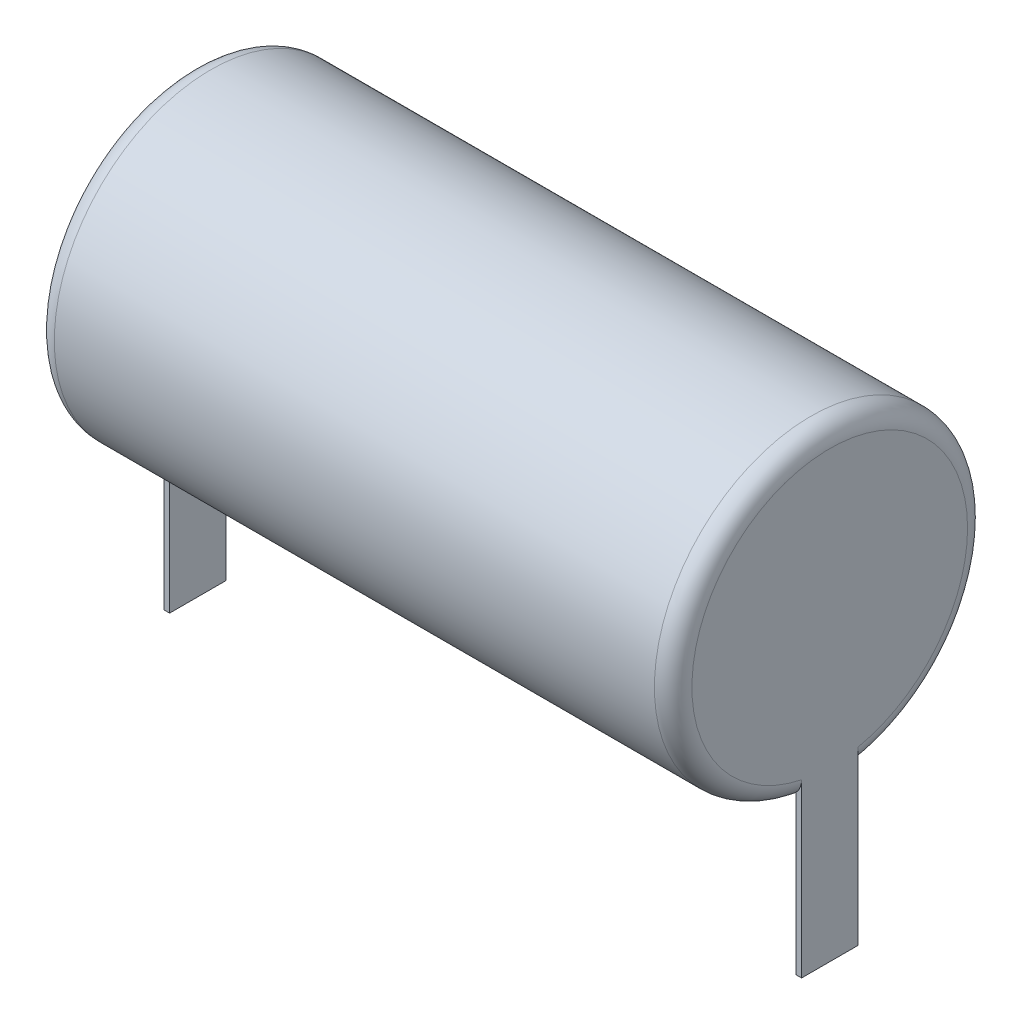
ISO-10303-21;
HEADER;
FILE_DESCRIPTION(('STEP AP214'),'2;1');
FILE_NAME('part.step','',(''),(''),'','','');
FILE_SCHEMA(('AUTOMOTIVE_DESIGN { 1 0 10303 214 1 1 1 1 }'));
ENDSEC;
DATA;
#1=APPLICATION_CONTEXT('core data for automotive mechanical design processes');
#2=APPLICATION_PROTOCOL_DEFINITION('international standard','automotive_design',2000,#1);
#3=PRODUCT_CONTEXT('',#1,'mechanical');
#4=PRODUCT('Part','Part','',(#3));
#5=PRODUCT_RELATED_PRODUCT_CATEGORY('part','',(#4));
#6=PRODUCT_DEFINITION_FORMATION('','',#4);
#7=PRODUCT_DEFINITION_CONTEXT('part definition',#1,'design');
#8=PRODUCT_DEFINITION('design','',#6,#7);
#9=PRODUCT_DEFINITION_SHAPE('','',#8);
#10=(LENGTH_UNIT() NAMED_UNIT(*) SI_UNIT(.MILLI.,.METRE.));
#11=(NAMED_UNIT(*) PLANE_ANGLE_UNIT() SI_UNIT($,.RADIAN.));
#12=(NAMED_UNIT(*) SI_UNIT($,.STERADIAN.) SOLID_ANGLE_UNIT());
#13=UNCERTAINTY_MEASURE_WITH_UNIT(LENGTH_MEASURE(1.E-05),#10,'distance_accuracy_value','');
#14=(GEOMETRIC_REPRESENTATION_CONTEXT(3) GLOBAL_UNCERTAINTY_ASSIGNED_CONTEXT((#13)) GLOBAL_UNIT_ASSIGNED_CONTEXT((#10,
#11,#12)) REPRESENTATION_CONTEXT('',''));
#15=CARTESIAN_POINT('',(0.,0.,0.));
#16=DIRECTION('',(0.,0.,1.));
#17=DIRECTION('',(1.,0.,0.));
#18=AXIS2_PLACEMENT_3D('',#15,#16,#17);
#19=CARTESIAN_POINT('',(-16.,0.,0.));
#20=DIRECTION('',(1.,0.,0.));
#21=DIRECTION('',(0.,0.,-1.));
#22=AXIS2_PLACEMENT_3D('',#19,#20,#21);
#23=TOROIDAL_SURFACE('',#22,7.35,1.);
#24=CARTESIAN_POINT('',(-16.,0.,0.));
#25=DIRECTION('',(1.,0.,0.));
#26=DIRECTION('',(0.,0.,-1.));
#27=AXIS2_PLACEMENT_3D('',#24,#25,#26);
#28=CIRCLE('',#27,8.35);
#29=CARTESIAN_POINT('',(-16.,0.,-8.35));
#30=VERTEX_POINT('',#29);
#31=EDGE_CURVE('E157',#30,#30,#28,.T.);
#32=ORIENTED_EDGE('',*,*,#31,.F.);
#33=EDGE_LOOP('',(#32));
#34=FACE_BOUND('',#33,.T.);
#35=CARTESIAN_POINT('',(-16.7,0.,0.));
#36=DIRECTION('',(1.,0.,0.));
#37=DIRECTION('',(0.,0.,-1.));
#38=AXIS2_PLACEMENT_3D('',#35,#36,#37);
#39=CIRCLE('',#38,8.06414284285429);
#40=CARTESIAN_POINT('',(-16.7,-7.92340834426436,-1.5));
#41=VERTEX_POINT('',#40);
#42=CARTESIAN_POINT('',(-16.7,-7.92340834426436,1.5));
#43=VERTEX_POINT('',#42);
#44=EDGE_CURVE('E209',#41,#43,#39,.F.);
#45=ORIENTED_EDGE('',*,*,#44,.F.);
#46=CARTESIAN_POINT('',(-16.6932983509553,-7.93003167277061,-1.5));
#47=CARTESIAN_POINT('',(-16.7342427925218,-7.88993890090227,-1.5));
#48=CARTESIAN_POINT('',(-16.7717881051022,-7.84630802779094,-1.5));
#49=CARTESIAN_POINT('',(-16.839015966995,-7.75329999233039,-1.5));
#50=CARTESIAN_POINT('',(-16.8686872504467,-7.70391474056949,-1.5));
#51=CARTESIAN_POINT('',(-16.9193252697565,-7.60094115994319,-1.5));
#52=CARTESIAN_POINT('',(-16.9403027302009,-7.54735810708623,-1.5));
#53=CARTESIAN_POINT('',(-16.9730859548653,-7.43747732619323,-1.5));
#54=CARTESIAN_POINT('',(-16.9848940256337,-7.38118028464449,-1.5));
#55=CARTESIAN_POINT('',(-16.9991777527898,-7.26667535349827,-1.5));
#56=CARTESIAN_POINT('',(-17.0015309191646,-7.20845217585216,-1.5));
#57=CARTESIAN_POINT('',(-16.9965387100887,-7.09241861168099,-1.5));
#58=CARTESIAN_POINT('',(-16.9891921439774,-7.03460827670901,-1.5));
#59=CARTESIAN_POINT('',(-16.9648787296374,-6.92041502029103,-1.5));
#60=CARTESIAN_POINT('',(-16.9478126554128,-6.86405318828612,-1.5));
#61=CARTESIAN_POINT('',(-16.9044353948116,-6.7550029797435,-1.5));
#62=CARTESIAN_POINT('',(-16.878124078997,-6.70231465464912,-1.5));
#63=CARTESIAN_POINT('',(-16.8170322363561,-6.6023091454247,-1.5));
#64=CARTESIAN_POINT('',(-16.7822769400861,-6.55497656473435,-1.5));
#65=CARTESIAN_POINT('',(-16.7051774501281,-6.46695355992478,-1.5));
#66=CARTESIAN_POINT('',(-16.6628339376824,-6.42626254017656,-1.5));
#67=CARTESIAN_POINT('',(-16.5725624484104,-6.35350936319254,-1.5));
#68=CARTESIAN_POINT('',(-16.5247507452171,-6.3213030273661,-1.5));
#69=CARTESIAN_POINT('',(-16.4242834799444,-6.26562880258829,-1.5));
#70=CARTESIAN_POINT('',(-16.3716287154141,-6.24215947803885,-1.5));
#71=CARTESIAN_POINT('',(-16.2644602299688,-6.20527073723047,-1.5));
#72=CARTESIAN_POINT('',(-16.210031947594,-6.1916029996893,-1.5));
#73=CARTESIAN_POINT('',(-16.0996397513237,-6.17380112044175,-1.5));
#74=CARTESIAN_POINT('',(-16.0436760445235,-6.16966569936779,-1.5));
#75=CARTESIAN_POINT('',(-15.9329551586638,-6.17105796857369,-1.5));
#76=CARTESIAN_POINT('',(-15.8781955515978,-6.17640058114026,-1.5));
#77=CARTESIAN_POINT('',(-15.770355065256,-6.1962082619048,-1.5));
#78=CARTESIAN_POINT('',(-15.7172741490863,-6.21067312946927,-1.5));
#79=CARTESIAN_POINT('',(-15.6142751916898,-6.24824229885436,-1.5));
#80=CARTESIAN_POINT('',(-15.5643568292509,-6.27134572162989,-1.5));
#81=CARTESIAN_POINT('',(-15.4690091570122,-6.32545658718836,-1.5));
#82=CARTESIAN_POINT('',(-15.4235802122787,-6.35646467202244,-1.5));
#83=CARTESIAN_POINT('',(-15.3375725735747,-6.4260977120265,-1.5));
#84=CARTESIAN_POINT('',(-15.2971005249041,-6.46485431817332,-1.5));
#85=CARTESIAN_POINT('',(-15.2230350958501,-6.54845929569506,-1.5));
#86=CARTESIAN_POINT('',(-15.1894426121338,-6.5933084598949,-1.5));
#87=CARTESIAN_POINT('',(-15.1291792667634,-6.68907368923822,-1.5));
#88=CARTESIAN_POINT('',(-15.102710306425,-6.74011684382195,-1.5));
#89=CARTESIAN_POINT('',(-15.0585288190707,-6.84586226150391,-1.5));
#90=CARTESIAN_POINT('',(-15.0408172858941,-6.90056493910488,-1.5));
#91=CARTESIAN_POINT('',(-15.0143421609444,-7.01321641980032,-1.5));
#92=CARTESIAN_POINT('',(-15.0057583950004,-7.07120755955228,-1.5));
#93=CARTESIAN_POINT('',(-14.9983938352166,-7.18781120226736,-1.5));
#94=CARTESIAN_POINT('',(-14.9996135067966,-7.24642373459927,-1.5));
#95=CARTESIAN_POINT('',(-15.011886916366,-7.36290605564904,-1.5));
#96=CARTESIAN_POINT('',(-15.0229890459036,-7.420770766236,-1.5));
#97=CARTESIAN_POINT('',(-15.0548390263584,-7.53378452495359,-1.5));
#98=CARTESIAN_POINT('',(-15.0755865513244,-7.58893366478304,-1.5));
#99=CARTESIAN_POINT('',(-15.1259706687922,-7.69439870691972,-1.5));
#100=CARTESIAN_POINT('',(-15.1555249911322,-7.74475388483379,-1.5));
#101=CARTESIAN_POINT('',(-15.2228061710563,-7.83967412278299,-1.5));
#102=CARTESIAN_POINT('',(-15.2605323292827,-7.88423967778073,-1.5));
#103=CARTESIAN_POINT('',(-15.3424054715157,-7.96550208855247,-1.5));
#104=CARTESIAN_POINT('',(-15.3864327147133,-8.0023195719462,-1.5));
#105=CARTESIAN_POINT('',(-15.4801356092621,-8.06788378259372,-1.5));
#106=CARTESIAN_POINT('',(-15.5298107053977,-8.096631302208,-1.5));
#107=CARTESIAN_POINT('',(-15.6324682907002,-8.14472354147739,-1.5));
#108=CARTESIAN_POINT('',(-15.6853783969373,-8.16422282346844,-1.5));
#109=CARTESIAN_POINT('',(-15.7937412130391,-8.19394010966336,-1.5));
#110=CARTESIAN_POINT('',(-15.8491936232795,-8.20415920464868,-1.5));
#111=CARTESIAN_POINT('',(-15.9603554957168,-8.21493118503891,-1.5));
#112=CARTESIAN_POINT('',(-16.0160538994183,-8.2155985264981,-1.5));
#113=CARTESIAN_POINT('',(-16.1267812727805,-8.20753919286053,-1.5));
#114=CARTESIAN_POINT('',(-16.1818100887574,-8.19881040081103,-1.5));
#115=CARTESIAN_POINT('',(-16.2894690136652,-8.17226527731808,-1.5));
#116=CARTESIAN_POINT('',(-16.3421050240041,-8.15447279149705,-1.5));
#117=CARTESIAN_POINT('',(-16.4436206524588,-8.11036485306026,-1.5));
#118=CARTESIAN_POINT('',(-16.4925047795518,-8.08405983562381,-1.5));
#119=CARTESIAN_POINT('',(-16.5665550062249,-8.03588453858669,-1.5));
#120=CARTESIAN_POINT('',(-16.5933583829525,-8.01647980792209,-1.5));
#121=CARTESIAN_POINT('',(-16.6449178180618,-7.97511988925947,-1.5));
#122=CARTESIAN_POINT('',(-16.6696738954734,-7.95316472497284,-1.5));
#123=CARTESIAN_POINT('',(-16.6932983509553,-7.93003167277061,-1.5));
#124=B_SPLINE_CURVE_WITH_KNOTS('',3,(#46,#47,#48,#49,#50,#51,#52,#53,#54,#55,#56,#57,#58,#59,
#60,#61,#62,#63,#64,#65,#66,#67,#68,#69,#70,#71,#72,#73,#74,#75,#76,#77,#78,#79,#80,#81,#82,#83,
#84,#85,#86,#87,#88,#89,#90,#91,#92,#93,#94,#95,#96,#97,#98,#99,#100,#101,#102,#103,#104,#105,
#106,#107,#108,#109,#110,#111,#112,#113,#114,#115,#116,#117,#118,#119,#120,#121,#122,#123),
.UNSPECIFIED.,.T.,.F.,(4,2,2,2,2,2,2,2,2,2,2,2,2,2,2,2,2,2,2,2,2,2,2,2,2,2,2,2,2,2,2,2,2,2,2,2,
2,2,4),(0.,0.17179205602247,0.343828596326594,0.515652278337541,0.687432724304037,
0.861431577976805,1.03545179232621,1.21128125935067,1.38711318817424,1.56242605786841,
1.73772319649101,1.90981491585102,2.08187834593791,2.24941178026751,2.41692272800326,
2.58119859810031,2.74547085526475,2.90972640090348,3.07399529234788,3.24133750591967,
3.40870151664087,3.58040213193854,3.7521222282645,3.92716602764579,4.10221813730899,
4.27813217107007,4.4540402605241,4.62835401174839,4.80265285083588,4.97399576288819,
5.14532184551192,5.31367384275298,5.48200604955124,5.64831946541481,5.8146703596033,
5.98058584518084,6.14629870706281,6.24542160027003,6.34454357200466),.UNSPECIFIED.);
#125=CARTESIAN_POINT('',(-17.,-7.19531097312687,-1.5));
#126=VERTEX_POINT('',#125);
#127=EDGE_CURVE('E11',#41,#126,#124,.T.);
#128=ORIENTED_EDGE('',*,*,#127,.T.);
#129=CARTESIAN_POINT('',(-17.,0.,0.));
#130=DIRECTION('',(1.,0.,0.));
#131=DIRECTION('',(0.,0.,-1.));
#132=AXIS2_PLACEMENT_3D('',#129,#130,#131);
#133=CIRCLE('',#132,7.35);
#134=CARTESIAN_POINT('',(-17.,-7.19531097312687,1.5));
#135=VERTEX_POINT('',#134);
#136=EDGE_CURVE('E160',#135,#126,#133,.F.);
#137=ORIENTED_EDGE('',*,*,#136,.F.);
#138=CARTESIAN_POINT('',(-16.6932983509553,-7.93003167277061,1.5));
#139=CARTESIAN_POINT('',(-16.653355639225,-7.96913654820077,1.5));
#140=CARTESIAN_POINT('',(-16.6101217975499,-8.00493182752507,1.5));
#141=CARTESIAN_POINT('',(-16.5182391478145,-8.06880792635938,1.5));
#142=CARTESIAN_POINT('',(-16.4695849421854,-8.09688095785975,1.5));
#143=CARTESIAN_POINT('',(-16.3682297666322,-8.14442965836644,1.5));
#144=CARTESIAN_POINT('',(-16.3155284636396,-8.16390461887592,1.5));
#145=CARTESIAN_POINT('',(-16.2075993292904,-8.19364054112096,1.5));
#146=CARTESIAN_POINT('',(-16.1523720899973,-8.20390365054208,1.5));
#147=CARTESIAN_POINT('',(-16.0414318975256,-8.21485771362063,1.5));
#148=CARTESIAN_POINT('',(-15.9857265750915,-8.21562602473534,1.5));
#149=CARTESIAN_POINT('',(-15.8749826974606,-8.20776646079718,1.5));
#150=CARTESIAN_POINT('',(-15.8199441428704,-8.1991385771974,1.5));
#151=CARTESIAN_POINT('',(-15.7122732655882,-8.17279562752665,1.5));
#152=CARTESIAN_POINT('',(-15.6596338981336,-8.15510932164381,1.5));
#153=CARTESIAN_POINT('',(-15.5580454529198,-8.11120373592409,1.5));
#154=CARTESIAN_POINT('',(-15.5090964321578,-8.08498432432751,1.5));
#155=CARTESIAN_POINT('',(-15.4159327544813,-8.02460580936885,1.5));
#156=CARTESIAN_POINT('',(-15.3717497457166,-7.99039789889281,1.5));
#157=CARTESIAN_POINT('',(-15.2896555547892,-7.91514358688295,1.5));
#158=CARTESIAN_POINT('',(-15.2517447445835,-7.87409678007518,1.5));
#159=CARTESIAN_POINT('',(-15.1826926535139,-7.78572694629688,1.5));
#160=CARTESIAN_POINT('',(-15.1516534392871,-7.73832418732267,1.5));
#161=CARTESIAN_POINT('',(-15.0978133175113,-7.6390522925289,1.5));
#162=CARTESIAN_POINT('',(-15.0750131506816,-7.58718275564922,1.5));
#163=CARTESIAN_POINT('',(-15.0378725779276,-7.47946777371243,1.5));
#164=CARTESIAN_POINT('',(-15.0236892770978,-7.42356815353907,1.5));
#165=CARTESIAN_POINT('',(-15.004750607751,-7.31019389469429,1.5));
#166=CARTESIAN_POINT('',(-14.9999961115766,-7.25271911078913,1.5));
#167=CARTESIAN_POINT('',(-15.0000039529322,-7.13687936313734,1.5));
#168=CARTESIAN_POINT('',(-15.0049145579158,-7.07851437442613,1.5));
#169=CARTESIAN_POINT('',(-15.0244003174773,-6.96341802535855,1.5));
#170=CARTESIAN_POINT('',(-15.0389760570289,-6.90668676409895,1.5));
#171=CARTESIAN_POINT('',(-15.077526277898,-6.79612292880134,1.5));
#172=CARTESIAN_POINT('',(-15.1015570797109,-6.7423099650679,1.5));
#173=CARTESIAN_POINT('',(-15.158388433953,-6.6395283215607,1.5));
#174=CARTESIAN_POINT('',(-15.1911888145816,-6.59055954691247,1.5));
#175=CARTESIAN_POINT('',(-15.2643644841738,-6.49936151433588,1.5));
#176=CARTESIAN_POINT('',(-15.3046700458758,-6.45707636041812,1.5));
#177=CARTESIAN_POINT('',(-15.3919537774551,-6.38006392927021,1.5));
#178=CARTESIAN_POINT('',(-15.4389311102165,-6.34533570524432,1.5));
#179=CARTESIAN_POINT('',(-15.5370950266685,-6.28528828200057,1.5));
#180=CARTESIAN_POINT('',(-15.5881618800943,-6.25977342597878,1.5));
#181=CARTESIAN_POINT('',(-15.6939323479001,-6.21793859617922,1.5));
#182=CARTESIAN_POINT('',(-15.7486353492256,-6.20161707677874,1.5));
#183=CARTESIAN_POINT('',(-15.8586175795718,-6.1790380587042,1.5));
#184=CARTESIAN_POINT('',(-15.9138461749158,-6.17253352989689,1.5));
#185=CARTESIAN_POINT('',(-16.0246019328013,-6.16902489809469,1.5));
#186=CARTESIAN_POINT('',(-16.0801290661989,-6.17201988396826,1.5));
#187=CARTESIAN_POINT('',(-16.1891467442306,-6.18730328614475,1.5));
#188=CARTESIAN_POINT('',(-16.2426543870102,-6.1994702776283,1.5));
#189=CARTESIAN_POINT('',(-16.3468915696101,-6.23254796206652,1.5));
#190=CARTESIAN_POINT('',(-16.397621054023,-6.25345882933625,1.5));
#191=CARTESIAN_POINT('',(-16.4953107745569,-6.30354693475418,1.5));
#192=CARTESIAN_POINT('',(-16.5422389051554,-6.33278671429115,1.5));
#193=CARTESIAN_POINT('',(-16.630665207172,-6.39856200332105,1.5));
#194=CARTESIAN_POINT('',(-16.6721627871495,-6.4350983063847,1.5));
#195=CARTESIAN_POINT('',(-16.7495810127158,-6.51531964984516,1.5));
#196=CARTESIAN_POINT('',(-16.7853507797867,-6.5591502627511,1.5));
#197=CARTESIAN_POINT('',(-16.8492385366322,-6.65207163940579,1.5));
#198=CARTESIAN_POINT('',(-16.8773555061063,-6.70116310333667,1.5));
#199=CARTESIAN_POINT('',(-16.9258524178485,-6.80452968857843,1.5));
#200=CARTESIAN_POINT('',(-16.9460222442221,-6.8589034550856,1.5));
#201=CARTESIAN_POINT('',(-16.9770945740093,-6.97023654846048,1.5));
#202=CARTESIAN_POINT('',(-16.987996566035,-7.02719601782148,1.5));
#203=CARTESIAN_POINT('',(-17.0003319281767,-7.14296058405481,1.5));
#204=CARTESIAN_POINT('',(-17.001627380219,-7.20178043207441,1.5));
#205=CARTESIAN_POINT('',(-16.9943192946588,-7.31882026342554,1.5));
#206=CARTESIAN_POINT('',(-16.9857131778446,-7.37704008647296,1.5));
#207=CARTESIAN_POINT('',(-16.9587954276732,-7.49117298250463,1.5));
#208=CARTESIAN_POINT('',(-16.9404863986083,-7.54708667012465,1.5));
#209=CARTESIAN_POINT('',(-16.8946279131629,-7.65493508374522,1.5));
#210=CARTESIAN_POINT('',(-16.867090047683,-7.70687470094388,1.5));
#211=CARTESIAN_POINT('',(-16.814964820096,-7.78755258328908,1.5));
#212=CARTESIAN_POINT('',(-16.792865968614,-7.81792724836252,1.5));
#213=CARTESIAN_POINT('',(-16.745438471585,-7.87604222099989,1.5));
#214=CARTESIAN_POINT('',(-16.7201098624096,-7.90378255822395,1.5));
#215=CARTESIAN_POINT('',(-16.6932983509553,-7.93003167277061,1.5));
#216=B_SPLINE_CURVE_WITH_KNOTS('',3,(#138,#139,#140,#141,#142,#143,#144,#145,#146,#147,#148,
#149,#150,#151,#152,#153,#154,#155,#156,#157,#158,#159,#160,#161,#162,#163,#164,#165,#166,#167,
#168,#169,#170,#171,#172,#173,#174,#175,#176,#177,#178,#179,#180,#181,#182,#183,#184,#185,#186,
#187,#188,#189,#190,#191,#192,#193,#194,#195,#196,#197,#198,#199,#200,#201,#202,#203,#204,#205,
#206,#207,#208,#209,#210,#211,#212,#213,#214,#215),.UNSPECIFIED.,.T.,.F.,(4,2,2,2,2,2,2,2,2,2,2,
2,2,2,2,2,2,2,2,2,2,2,2,2,2,2,2,2,2,2,2,2,2,2,2,2,2,2,4),(0.,0.167560271265016,
0.335288915282714,0.503031377870257,0.670734722184227,0.837070819029985,1.00340706717776,
1.16921844721817,1.33503238767379,1.50188720177169,1.66875190722796,1.83794979286456,
2.00716288620071,2.17937514606439,2.35160333807319,2.52649419263126,2.7013956332705,
2.87735506862727,3.05331105709841,3.22770723940344,3.4020815592913,3.57249831573898,
3.74288641244105,3.90891095507594,4.07491957420031,4.23876823770586,4.40262016780085,
4.56773644197413,4.73287068400147,4.90181749545365,5.07078682052546,5.24396405717499,
5.41715084891468,5.59281930131162,5.76853352309182,5.94420060648521,6.11964788358767,
6.23212384043228,6.34459853074962),.UNSPECIFIED.);
#217=EDGE_CURVE('E47',#135,#43,#216,.T.);
#218=ORIENTED_EDGE('',*,*,#217,.T.);
#219=EDGE_LOOP('',(#45,#128,#137,#218));
#220=FACE_BOUND('',#219,.T.);
#221=ADVANCED_FACE('F34',(#34,#220),#23,.T.);
#222=CARTESIAN_POINT('',(17.,0.,0.));
#223=DIRECTION('',(-1.,0.,0.));
#224=DIRECTION('',(0.,0.,1.));
#225=AXIS2_PLACEMENT_3D('',#222,#223,#224);
#226=CYLINDRICAL_SURFACE('',#225,8.35);
#227=ORIENTED_EDGE('',*,*,#31,.T.);
#228=EDGE_LOOP('',(#227));
#229=FACE_BOUND('',#228,.T.);
#230=CARTESIAN_POINT('',(16.,0.,0.));
#231=DIRECTION('',(1.,0.,0.));
#232=DIRECTION('',(0.,0.,-1.));
#233=AXIS2_PLACEMENT_3D('',#230,#231,#232);
#234=CIRCLE('',#233,8.35);
#235=CARTESIAN_POINT('',(16.,0.,-8.35));
#236=VERTEX_POINT('',#235);
#237=EDGE_CURVE('E152',#236,#236,#234,.F.);
#238=ORIENTED_EDGE('',*,*,#237,.T.);
#239=EDGE_LOOP('',(#238));
#240=FACE_BOUND('',#239,.T.);
#241=ADVANCED_FACE('F195',(#229,#240),#226,.T.);
#242=CARTESIAN_POINT('',(17.,0.,0.));
#243=DIRECTION('',(1.,0.,0.));
#244=DIRECTION('',(0.,0.,-1.));
#245=AXIS2_PLACEMENT_3D('',#242,#243,#244);
#246=PLANE('',#245);
#247=CARTESIAN_POINT('',(17.,0.,0.));
#248=DIRECTION('',(1.,0.,0.));
#249=DIRECTION('',(0.,0.,-1.));
#250=AXIS2_PLACEMENT_3D('',#247,#248,#249);
#251=CIRCLE('',#250,7.35);
#252=CARTESIAN_POINT('',(17.,-7.19531097312687,-1.5));
#253=VERTEX_POINT('',#252);
#254=CARTESIAN_POINT('',(17.,-7.19531097312687,1.5));
#255=VERTEX_POINT('',#254);
#256=EDGE_CURVE('E162',#253,#255,#251,.T.);
#257=ORIENTED_EDGE('',*,*,#256,.T.);
#258=DIRECTION('',(0.,-1.,0.));
#259=VECTOR('',#258,1.);
#260=CARTESIAN_POINT('',(17.,-16.35,1.5));
#261=LINE('',#260,#259);
#262=CARTESIAN_POINT('',(17.,-16.35,1.5));
#263=VERTEX_POINT('',#262);
#264=EDGE_CURVE('E147',#255,#263,#261,.T.);
#265=ORIENTED_EDGE('',*,*,#264,.T.);
#266=DIRECTION('',(0.,0.,-1.));
#267=VECTOR('',#266,1.);
#268=CARTESIAN_POINT('',(17.,-16.35,1.5));
#269=LINE('',#268,#267);
#270=CARTESIAN_POINT('',(17.,-16.35,-1.5));
#271=VERTEX_POINT('',#270);
#272=EDGE_CURVE('E140',#263,#271,#269,.T.);
#273=ORIENTED_EDGE('',*,*,#272,.T.);
#274=DIRECTION('',(0.,1.,0.));
#275=VECTOR('',#274,1.);
#276=CARTESIAN_POINT('',(17.,-16.35,-1.5));
#277=LINE('',#276,#275);
#278=EDGE_CURVE('E62',#271,#253,#277,.T.);
#279=ORIENTED_EDGE('',*,*,#278,.T.);
#280=EDGE_LOOP('',(#257,#265,#273,#279));
#281=FACE_BOUND('',#280,.T.);
#282=ADVANCED_FACE('F191',(#281),#246,.T.);
#283=CARTESIAN_POINT('',(-17.,0.,0.));
#284=DIRECTION('',(1.,0.,0.));
#285=DIRECTION('',(0.,0.,-1.));
#286=AXIS2_PLACEMENT_3D('',#283,#284,#285);
#287=PLANE('',#286);
#288=ORIENTED_EDGE('',*,*,#136,.T.);
#289=DIRECTION('',(0.,1.,0.));
#290=VECTOR('',#289,1.);
#291=CARTESIAN_POINT('',(-17.,-16.35,-1.5));
#292=LINE('',#291,#290);
#293=CARTESIAN_POINT('',(-17.,-16.35,-1.5));
#294=VERTEX_POINT('',#293);
#295=EDGE_CURVE('E132',#294,#126,#292,.T.);
#296=ORIENTED_EDGE('',*,*,#295,.F.);
#297=DIRECTION('',(0.,0.,-1.));
#298=VECTOR('',#297,1.);
#299=CARTESIAN_POINT('',(-17.,-16.35,1.5));
#300=LINE('',#299,#298);
#301=CARTESIAN_POINT('',(-17.,-16.35,1.5));
#302=VERTEX_POINT('',#301);
#303=EDGE_CURVE('E122',#302,#294,#300,.T.);
#304=ORIENTED_EDGE('',*,*,#303,.F.);
#305=DIRECTION('',(0.,-1.,0.));
#306=VECTOR('',#305,1.);
#307=CARTESIAN_POINT('',(-17.,-16.35,1.5));
#308=LINE('',#307,#306);
#309=EDGE_CURVE('E54',#135,#302,#308,.T.);
#310=ORIENTED_EDGE('',*,*,#309,.F.);
#311=EDGE_LOOP('',(#288,#296,#304,#310));
#312=FACE_BOUND('',#311,.T.);
#313=ADVANCED_FACE('F194',(#312),#287,.F.);
#314=CARTESIAN_POINT('',(16.,0.,0.));
#315=DIRECTION('',(1.,0.,0.));
#316=DIRECTION('',(0.,0.,-1.));
#317=AXIS2_PLACEMENT_3D('',#314,#315,#316);
#318=TOROIDAL_SURFACE('',#317,7.35,1.);
#319=CARTESIAN_POINT('',(16.6932983509553,-7.93003167277061,-1.5));
#320=CARTESIAN_POINT('',(16.7342427925218,-7.88993890090227,-1.5));
#321=CARTESIAN_POINT('',(16.7717881051022,-7.84630802779094,-1.5));
#322=CARTESIAN_POINT('',(16.839015966995,-7.75329999233039,-1.5));
#323=CARTESIAN_POINT('',(16.8686872504467,-7.70391474056949,-1.5));
#324=CARTESIAN_POINT('',(16.9193252697565,-7.60094115994319,-1.5));
#325=CARTESIAN_POINT('',(16.9403027302009,-7.54735810708623,-1.5));
#326=CARTESIAN_POINT('',(16.9730859548653,-7.43747732619323,-1.5));
#327=CARTESIAN_POINT('',(16.9848940256337,-7.38118028464449,-1.5));
#328=CARTESIAN_POINT('',(16.9991777527898,-7.26667535349827,-1.5));
#329=CARTESIAN_POINT('',(17.0015309191646,-7.20845217585216,-1.5));
#330=CARTESIAN_POINT('',(16.9965387100887,-7.09241861168099,-1.5));
#331=CARTESIAN_POINT('',(16.9891921439774,-7.03460827670901,-1.5));
#332=CARTESIAN_POINT('',(16.9648787296374,-6.92041502029103,-1.5));
#333=CARTESIAN_POINT('',(16.9478126554128,-6.86405318828612,-1.5));
#334=CARTESIAN_POINT('',(16.9044353948116,-6.7550029797435,-1.5));
#335=CARTESIAN_POINT('',(16.878124078997,-6.70231465464912,-1.5));
#336=CARTESIAN_POINT('',(16.8170322363561,-6.6023091454247,-1.5));
#337=CARTESIAN_POINT('',(16.7822769400861,-6.55497656473435,-1.5));
#338=CARTESIAN_POINT('',(16.7051774501281,-6.46695355992478,-1.5));
#339=CARTESIAN_POINT('',(16.6628339376824,-6.42626254017656,-1.5));
#340=CARTESIAN_POINT('',(16.5725624484104,-6.35350936319254,-1.5));
#341=CARTESIAN_POINT('',(16.5247507452171,-6.3213030273661,-1.5));
#342=CARTESIAN_POINT('',(16.4242834799444,-6.26562880258829,-1.5));
#343=CARTESIAN_POINT('',(16.3716287154141,-6.24215947803885,-1.5));
#344=CARTESIAN_POINT('',(16.2644602299688,-6.20527073723047,-1.5));
#345=CARTESIAN_POINT('',(16.210031947594,-6.1916029996893,-1.5));
#346=CARTESIAN_POINT('',(16.0996397513237,-6.17380112044175,-1.5));
#347=CARTESIAN_POINT('',(16.0436760445235,-6.16966569936779,-1.5));
#348=CARTESIAN_POINT('',(15.9329551586638,-6.17105796857369,-1.5));
#349=CARTESIAN_POINT('',(15.8781955515978,-6.17640058114026,-1.5));
#350=CARTESIAN_POINT('',(15.770355065256,-6.1962082619048,-1.5));
#351=CARTESIAN_POINT('',(15.7172741490863,-6.21067312946927,-1.5));
#352=CARTESIAN_POINT('',(15.6142751916898,-6.24824229885436,-1.5));
#353=CARTESIAN_POINT('',(15.5643568292509,-6.27134572162989,-1.5));
#354=CARTESIAN_POINT('',(15.4690091570122,-6.32545658718836,-1.5));
#355=CARTESIAN_POINT('',(15.4235802122787,-6.35646467202244,-1.5));
#356=CARTESIAN_POINT('',(15.3375725735747,-6.4260977120265,-1.5));
#357=CARTESIAN_POINT('',(15.2971005249041,-6.46485431817332,-1.5));
#358=CARTESIAN_POINT('',(15.2230350958501,-6.54845929569506,-1.5));
#359=CARTESIAN_POINT('',(15.1894426121338,-6.5933084598949,-1.5));
#360=CARTESIAN_POINT('',(15.1291792667634,-6.68907368923822,-1.5));
#361=CARTESIAN_POINT('',(15.102710306425,-6.74011684382195,-1.5));
#362=CARTESIAN_POINT('',(15.0585288190707,-6.84586226150391,-1.5));
#363=CARTESIAN_POINT('',(15.0408172858941,-6.90056493910488,-1.5));
#364=CARTESIAN_POINT('',(15.0143421609444,-7.01321641980032,-1.5));
#365=CARTESIAN_POINT('',(15.0057583950004,-7.07120755955228,-1.5));
#366=CARTESIAN_POINT('',(14.9983938352166,-7.18781120226736,-1.5));
#367=CARTESIAN_POINT('',(14.9996135067966,-7.24642373459927,-1.5));
#368=CARTESIAN_POINT('',(15.011886916366,-7.36290605564904,-1.5));
#369=CARTESIAN_POINT('',(15.0229890459036,-7.420770766236,-1.5));
#370=CARTESIAN_POINT('',(15.0548390263584,-7.53378452495359,-1.5));
#371=CARTESIAN_POINT('',(15.0755865513244,-7.58893366478304,-1.5));
#372=CARTESIAN_POINT('',(15.1259706687922,-7.69439870691972,-1.5));
#373=CARTESIAN_POINT('',(15.1555249911322,-7.74475388483379,-1.5));
#374=CARTESIAN_POINT('',(15.2228061710563,-7.83967412278299,-1.5));
#375=CARTESIAN_POINT('',(15.2605323292827,-7.88423967778073,-1.5));
#376=CARTESIAN_POINT('',(15.3424054715157,-7.96550208855247,-1.5));
#377=CARTESIAN_POINT('',(15.3864327147133,-8.0023195719462,-1.5));
#378=CARTESIAN_POINT('',(15.4801356092621,-8.06788378259372,-1.5));
#379=CARTESIAN_POINT('',(15.5298107053977,-8.096631302208,-1.5));
#380=CARTESIAN_POINT('',(15.6324682907002,-8.14472354147739,-1.5));
#381=CARTESIAN_POINT('',(15.6853783969373,-8.16422282346844,-1.5));
#382=CARTESIAN_POINT('',(15.7937412130391,-8.19394010966336,-1.5));
#383=CARTESIAN_POINT('',(15.8491936232795,-8.20415920464868,-1.5));
#384=CARTESIAN_POINT('',(15.9603554957168,-8.21493118503891,-1.5));
#385=CARTESIAN_POINT('',(16.0160538994183,-8.2155985264981,-1.5));
#386=CARTESIAN_POINT('',(16.1267812727805,-8.20753919286053,-1.5));
#387=CARTESIAN_POINT('',(16.1818100887574,-8.19881040081103,-1.5));
#388=CARTESIAN_POINT('',(16.2894690136652,-8.17226527731808,-1.5));
#389=CARTESIAN_POINT('',(16.3421050240041,-8.15447279149705,-1.5));
#390=CARTESIAN_POINT('',(16.4436206524588,-8.11036485306026,-1.5));
#391=CARTESIAN_POINT('',(16.4925047795518,-8.08405983562381,-1.5));
#392=CARTESIAN_POINT('',(16.5665550062249,-8.03588453858669,-1.5));
#393=CARTESIAN_POINT('',(16.5933583829525,-8.01647980792209,-1.5));
#394=CARTESIAN_POINT('',(16.6449178180618,-7.97511988925947,-1.5));
#395=CARTESIAN_POINT('',(16.6696738954734,-7.95316472497284,-1.5));
#396=CARTESIAN_POINT('',(16.6932983509553,-7.93003167277061,-1.5));
#397=B_SPLINE_CURVE_WITH_KNOTS('',3,(#319,#320,#321,#322,#323,#324,#325,#326,#327,#328,#329,
#330,#331,#332,#333,#334,#335,#336,#337,#338,#339,#340,#341,#342,#343,#344,#345,#346,#347,#348,
#349,#350,#351,#352,#353,#354,#355,#356,#357,#358,#359,#360,#361,#362,#363,#364,#365,#366,#367,
#368,#369,#370,#371,#372,#373,#374,#375,#376,#377,#378,#379,#380,#381,#382,#383,#384,#385,#386,
#387,#388,#389,#390,#391,#392,#393,#394,#395,#396),.UNSPECIFIED.,.T.,.F.,(4,2,2,2,2,2,2,2,2,2,2,
2,2,2,2,2,2,2,2,2,2,2,2,2,2,2,2,2,2,2,2,2,2,2,2,2,2,2,4),(0.,0.17179205602247,0.343828596326594,
0.515652278337541,0.687432724304037,0.861431577976805,1.03545179232621,1.21128125935067,
1.38711318817424,1.56242605786841,1.73772319649101,1.90981491585102,2.08187834593791,
2.24941178026751,2.41692272800326,2.58119859810031,2.74547085526475,2.90972640090348,
3.07399529234788,3.24133750591967,3.40870151664087,3.58040213193854,3.7521222282645,
3.92716602764579,4.10221813730899,4.27813217107007,4.4540402605241,4.62835401174839,
4.80265285083588,4.97399576288819,5.14532184551192,5.31367384275298,5.48200604955124,
5.64831946541481,5.8146703596033,5.98058584518084,6.14629870706281,6.24542160027003,
6.34454357200466),.UNSPECIFIED.);
#398=CARTESIAN_POINT('',(16.7,-7.92340834426436,-1.5));
#399=VERTEX_POINT('',#398);
#400=EDGE_CURVE('E172',#399,#253,#397,.T.);
#401=ORIENTED_EDGE('',*,*,#400,.F.);
#402=CARTESIAN_POINT('',(16.7,0.,0.));
#403=DIRECTION('',(-1.,0.,0.));
#404=DIRECTION('',(0.,0.,1.));
#405=AXIS2_PLACEMENT_3D('',#402,#403,#404);
#406=CIRCLE('',#405,8.06414284285429);
#407=CARTESIAN_POINT('',(16.7,-7.92340834426436,1.5));
#408=VERTEX_POINT('',#407);
#409=EDGE_CURVE('E164',#408,#399,#406,.F.);
#410=ORIENTED_EDGE('',*,*,#409,.F.);
#411=CARTESIAN_POINT('',(16.6932983509553,-7.93003167277061,1.5));
#412=CARTESIAN_POINT('',(16.653355639225,-7.96913654820077,1.5));
#413=CARTESIAN_POINT('',(16.6101217975499,-8.00493182752507,1.5));
#414=CARTESIAN_POINT('',(16.5182391478145,-8.06880792635938,1.5));
#415=CARTESIAN_POINT('',(16.4695849421854,-8.09688095785975,1.5));
#416=CARTESIAN_POINT('',(16.3682297666322,-8.14442965836644,1.5));
#417=CARTESIAN_POINT('',(16.3155284636396,-8.16390461887592,1.5));
#418=CARTESIAN_POINT('',(16.2075993292904,-8.19364054112096,1.5));
#419=CARTESIAN_POINT('',(16.1523720899973,-8.20390365054208,1.5));
#420=CARTESIAN_POINT('',(16.0414318975256,-8.21485771362063,1.5));
#421=CARTESIAN_POINT('',(15.9857265750915,-8.21562602473534,1.5));
#422=CARTESIAN_POINT('',(15.8749826974606,-8.20776646079718,1.5));
#423=CARTESIAN_POINT('',(15.8199441428704,-8.1991385771974,1.5));
#424=CARTESIAN_POINT('',(15.7122732655882,-8.17279562752665,1.5));
#425=CARTESIAN_POINT('',(15.6596338981336,-8.15510932164381,1.5));
#426=CARTESIAN_POINT('',(15.5580454529198,-8.11120373592409,1.5));
#427=CARTESIAN_POINT('',(15.5090964321578,-8.08498432432751,1.5));
#428=CARTESIAN_POINT('',(15.4159327544813,-8.02460580936885,1.5));
#429=CARTESIAN_POINT('',(15.3717497457166,-7.99039789889281,1.5));
#430=CARTESIAN_POINT('',(15.2896555547892,-7.91514358688295,1.5));
#431=CARTESIAN_POINT('',(15.2517447445835,-7.87409678007518,1.5));
#432=CARTESIAN_POINT('',(15.1826926535139,-7.78572694629688,1.5));
#433=CARTESIAN_POINT('',(15.1516534392871,-7.73832418732267,1.5));
#434=CARTESIAN_POINT('',(15.0978133175113,-7.6390522925289,1.5));
#435=CARTESIAN_POINT('',(15.0750131506816,-7.58718275564922,1.5));
#436=CARTESIAN_POINT('',(15.0378725779276,-7.47946777371243,1.5));
#437=CARTESIAN_POINT('',(15.0236892770978,-7.42356815353907,1.5));
#438=CARTESIAN_POINT('',(15.004750607751,-7.31019389469429,1.5));
#439=CARTESIAN_POINT('',(14.9999961115766,-7.25271911078913,1.5));
#440=CARTESIAN_POINT('',(15.0000039529322,-7.13687936313734,1.5));
#441=CARTESIAN_POINT('',(15.0049145579158,-7.07851437442613,1.5));
#442=CARTESIAN_POINT('',(15.0244003174773,-6.96341802535855,1.5));
#443=CARTESIAN_POINT('',(15.0389760570289,-6.90668676409895,1.5));
#444=CARTESIAN_POINT('',(15.077526277898,-6.79612292880134,1.5));
#445=CARTESIAN_POINT('',(15.1015570797109,-6.7423099650679,1.5));
#446=CARTESIAN_POINT('',(15.158388433953,-6.6395283215607,1.5));
#447=CARTESIAN_POINT('',(15.1911888145816,-6.59055954691247,1.5));
#448=CARTESIAN_POINT('',(15.2643644841738,-6.49936151433588,1.5));
#449=CARTESIAN_POINT('',(15.3046700458758,-6.45707636041812,1.5));
#450=CARTESIAN_POINT('',(15.3919537774551,-6.38006392927021,1.5));
#451=CARTESIAN_POINT('',(15.4389311102165,-6.34533570524432,1.5));
#452=CARTESIAN_POINT('',(15.5370950266685,-6.28528828200057,1.5));
#453=CARTESIAN_POINT('',(15.5881618800943,-6.25977342597878,1.5));
#454=CARTESIAN_POINT('',(15.6939323479001,-6.21793859617922,1.5));
#455=CARTESIAN_POINT('',(15.7486353492256,-6.20161707677874,1.5));
#456=CARTESIAN_POINT('',(15.8586175795718,-6.1790380587042,1.5));
#457=CARTESIAN_POINT('',(15.9138461749158,-6.17253352989689,1.5));
#458=CARTESIAN_POINT('',(16.0246019328013,-6.16902489809469,1.5));
#459=CARTESIAN_POINT('',(16.0801290661989,-6.17201988396826,1.5));
#460=CARTESIAN_POINT('',(16.1891467442306,-6.18730328614475,1.5));
#461=CARTESIAN_POINT('',(16.2426543870102,-6.1994702776283,1.5));
#462=CARTESIAN_POINT('',(16.3468915696101,-6.23254796206652,1.5));
#463=CARTESIAN_POINT('',(16.397621054023,-6.25345882933625,1.5));
#464=CARTESIAN_POINT('',(16.4953107745569,-6.30354693475418,1.5));
#465=CARTESIAN_POINT('',(16.5422389051554,-6.33278671429115,1.5));
#466=CARTESIAN_POINT('',(16.630665207172,-6.39856200332105,1.5));
#467=CARTESIAN_POINT('',(16.6721627871495,-6.4350983063847,1.5));
#468=CARTESIAN_POINT('',(16.7495810127158,-6.51531964984516,1.5));
#469=CARTESIAN_POINT('',(16.7853507797867,-6.5591502627511,1.5));
#470=CARTESIAN_POINT('',(16.8492385366322,-6.65207163940579,1.5));
#471=CARTESIAN_POINT('',(16.8773555061063,-6.70116310333667,1.5));
#472=CARTESIAN_POINT('',(16.9258524178485,-6.80452968857843,1.5));
#473=CARTESIAN_POINT('',(16.9460222442221,-6.8589034550856,1.5));
#474=CARTESIAN_POINT('',(16.9770945740093,-6.97023654846048,1.5));
#475=CARTESIAN_POINT('',(16.987996566035,-7.02719601782148,1.5));
#476=CARTESIAN_POINT('',(17.0003319281767,-7.14296058405481,1.5));
#477=CARTESIAN_POINT('',(17.001627380219,-7.20178043207441,1.5));
#478=CARTESIAN_POINT('',(16.9943192946588,-7.31882026342554,1.5));
#479=CARTESIAN_POINT('',(16.9857131778446,-7.37704008647296,1.5));
#480=CARTESIAN_POINT('',(16.9587954276732,-7.49117298250463,1.5));
#481=CARTESIAN_POINT('',(16.9404863986083,-7.54708667012465,1.5));
#482=CARTESIAN_POINT('',(16.8946279131629,-7.65493508374522,1.5));
#483=CARTESIAN_POINT('',(16.867090047683,-7.70687470094388,1.5));
#484=CARTESIAN_POINT('',(16.814964820096,-7.78755258328908,1.5));
#485=CARTESIAN_POINT('',(16.792865968614,-7.81792724836252,1.5));
#486=CARTESIAN_POINT('',(16.745438471585,-7.87604222099989,1.5));
#487=CARTESIAN_POINT('',(16.7201098624096,-7.90378255822395,1.5));
#488=CARTESIAN_POINT('',(16.6932983509553,-7.93003167277061,1.5));
#489=B_SPLINE_CURVE_WITH_KNOTS('',3,(#411,#412,#413,#414,#415,#416,#417,#418,#419,#420,#421,
#422,#423,#424,#425,#426,#427,#428,#429,#430,#431,#432,#433,#434,#435,#436,#437,#438,#439,#440,
#441,#442,#443,#444,#445,#446,#447,#448,#449,#450,#451,#452,#453,#454,#455,#456,#457,#458,#459,
#460,#461,#462,#463,#464,#465,#466,#467,#468,#469,#470,#471,#472,#473,#474,#475,#476,#477,#478,
#479,#480,#481,#482,#483,#484,#485,#486,#487,#488),.UNSPECIFIED.,.T.,.F.,(4,2,2,2,2,2,2,2,2,2,2,
2,2,2,2,2,2,2,2,2,2,2,2,2,2,2,2,2,2,2,2,2,2,2,2,2,2,2,4),(0.,0.167560271265016,
0.335288915282714,0.503031377870257,0.670734722184227,0.837070819029985,1.00340706717776,
1.16921844721817,1.33503238767379,1.50188720177169,1.66875190722796,1.83794979286456,
2.00716288620071,2.17937514606439,2.35160333807319,2.52649419263126,2.7013956332705,
2.87735506862727,3.05331105709841,3.22770723940344,3.4020815592913,3.57249831573898,
3.74288641244105,3.90891095507594,4.07491957420031,4.23876823770586,4.40262016780085,
4.56773644197413,4.73287068400147,4.90181749545365,5.07078682052546,5.24396405717499,
5.41715084891468,5.59281930131162,5.76853352309182,5.94420060648521,6.11964788358767,
6.23212384043228,6.34459853074962),.UNSPECIFIED.);
#490=EDGE_CURVE('E166',#255,#408,#489,.T.);
#491=ORIENTED_EDGE('',*,*,#490,.F.);
#492=ORIENTED_EDGE('',*,*,#256,.F.);
#493=EDGE_LOOP('',(#401,#410,#491,#492));
#494=FACE_BOUND('',#493,.T.);
#495=ORIENTED_EDGE('',*,*,#237,.F.);
#496=EDGE_LOOP('',(#495));
#497=FACE_BOUND('',#496,.T.);
#498=ADVANCED_FACE('F36',(#494,#497),#318,.T.);
#499=CARTESIAN_POINT('',(16.7,-16.35,-1.5));
#500=DIRECTION('',(0.,0.,-1.));
#501=DIRECTION('',(-1.,0.,0.));
#502=AXIS2_PLACEMENT_3D('',#499,#500,#501);
#503=PLANE('',#502);
#504=DIRECTION('',(0.,1.,0.));
#505=VECTOR('',#504,1.);
#506=CARTESIAN_POINT('',(16.7,-16.35,-1.5));
#507=LINE('',#506,#505);
#508=CARTESIAN_POINT('',(16.7,-16.35,-1.5));
#509=VERTEX_POINT('',#508);
#510=EDGE_CURVE('E136',#509,#399,#507,.T.);
#511=ORIENTED_EDGE('',*,*,#510,.T.);
#512=ORIENTED_EDGE('',*,*,#400,.T.);
#513=ORIENTED_EDGE('',*,*,#278,.F.);
#514=DIRECTION('',(1.,0.,0.));
#515=VECTOR('',#514,1.);
#516=CARTESIAN_POINT('',(16.7,-16.35,-1.5));
#517=LINE('',#516,#515);
#518=EDGE_CURVE('E150',#509,#271,#517,.T.);
#519=ORIENTED_EDGE('',*,*,#518,.F.);
#520=EDGE_LOOP('',(#511,#512,#513,#519));
#521=FACE_BOUND('',#520,.T.);
#522=ADVANCED_FACE('F186',(#521),#503,.T.);
#523=CARTESIAN_POINT('',(16.7,-16.35,1.5));
#524=DIRECTION('',(0.,-1.,0.));
#525=DIRECTION('',(0.,0.,-1.));
#526=AXIS2_PLACEMENT_3D('',#523,#524,#525);
#527=PLANE('',#526);
#528=ORIENTED_EDGE('',*,*,#272,.F.);
#529=DIRECTION('',(1.,0.,0.));
#530=VECTOR('',#529,1.);
#531=CARTESIAN_POINT('',(16.7,-16.35,1.5));
#532=LINE('',#531,#530);
#533=CARTESIAN_POINT('',(16.7,-16.35,1.5));
#534=VERTEX_POINT('',#533);
#535=EDGE_CURVE('E145',#534,#263,#532,.T.);
#536=ORIENTED_EDGE('',*,*,#535,.F.);
#537=DIRECTION('',(0.,0.,-1.));
#538=VECTOR('',#537,1.);
#539=CARTESIAN_POINT('',(16.7,-16.35,1.5));
#540=LINE('',#539,#538);
#541=EDGE_CURVE('E142',#534,#509,#540,.T.);
#542=ORIENTED_EDGE('',*,*,#541,.T.);
#543=ORIENTED_EDGE('',*,*,#518,.T.);
#544=EDGE_LOOP('',(#528,#536,#542,#543));
#545=FACE_BOUND('',#544,.T.);
#546=ADVANCED_FACE('F183',(#545),#527,.T.);
#547=CARTESIAN_POINT('',(16.7,-16.35,1.5));
#548=DIRECTION('',(0.,0.,1.));
#549=DIRECTION('',(1.,0.,0.));
#550=AXIS2_PLACEMENT_3D('',#547,#548,#549);
#551=PLANE('',#550);
#552=ORIENTED_EDGE('',*,*,#264,.F.);
#553=ORIENTED_EDGE('',*,*,#490,.T.);
#554=DIRECTION('',(0.,-1.,0.));
#555=VECTOR('',#554,1.);
#556=CARTESIAN_POINT('',(16.7,-16.35,1.5));
#557=LINE('',#556,#555);
#558=EDGE_CURVE('E139',#408,#534,#557,.T.);
#559=ORIENTED_EDGE('',*,*,#558,.T.);
#560=ORIENTED_EDGE('',*,*,#535,.T.);
#561=EDGE_LOOP('',(#552,#553,#559,#560));
#562=FACE_BOUND('',#561,.T.);
#563=ADVANCED_FACE('F178',(#562),#551,.T.);
#564=CARTESIAN_POINT('',(16.7,0.,0.));
#565=DIRECTION('',(-1.,0.,0.));
#566=DIRECTION('',(0.,0.,1.));
#567=AXIS2_PLACEMENT_3D('',#564,#565,#566);
#568=PLANE('',#567);
#569=ORIENTED_EDGE('',*,*,#558,.F.);
#570=ORIENTED_EDGE('',*,*,#409,.T.);
#571=ORIENTED_EDGE('',*,*,#510,.F.);
#572=ORIENTED_EDGE('',*,*,#541,.F.);
#573=EDGE_LOOP('',(#569,#570,#571,#572));
#574=FACE_BOUND('',#573,.T.);
#575=ADVANCED_FACE('F182',(#574),#568,.T.);
#576=CARTESIAN_POINT('',(-16.7,-16.35,-1.5));
#577=DIRECTION('',(0.,0.,1.));
#578=DIRECTION('',(1.,0.,0.));
#579=AXIS2_PLACEMENT_3D('',#576,#577,#578);
#580=PLANE('',#579);
#581=ORIENTED_EDGE('',*,*,#127,.F.);
#582=DIRECTION('',(0.,1.,0.));
#583=VECTOR('',#582,1.);
#584=CARTESIAN_POINT('',(-16.7,-16.35,-1.5));
#585=LINE('',#584,#583);
#586=CARTESIAN_POINT('',(-16.7,-16.35,-1.5));
#587=VERTEX_POINT('',#586);
#588=EDGE_CURVE('E111',#587,#41,#585,.T.);
#589=ORIENTED_EDGE('',*,*,#588,.F.);
#590=DIRECTION('',(-1.,0.,0.));
#591=VECTOR('',#590,1.);
#592=CARTESIAN_POINT('',(-16.7,-16.35,-1.5));
#593=LINE('',#592,#591);
#594=EDGE_CURVE('E120',#587,#294,#593,.T.);
#595=ORIENTED_EDGE('',*,*,#594,.T.);
#596=ORIENTED_EDGE('',*,*,#295,.T.);
#597=EDGE_LOOP('',(#581,#589,#595,#596));
#598=FACE_BOUND('',#597,.T.);
#599=ADVANCED_FACE('F127',(#598),#580,.F.);
#600=CARTESIAN_POINT('',(-16.7,-16.35,1.5));
#601=DIRECTION('',(0.,0.,-1.));
#602=DIRECTION('',(-1.,0.,0.));
#603=AXIS2_PLACEMENT_3D('',#600,#601,#602);
#604=PLANE('',#603);
#605=ORIENTED_EDGE('',*,*,#217,.F.);
#606=ORIENTED_EDGE('',*,*,#309,.T.);
#607=DIRECTION('',(-1.,0.,0.));
#608=VECTOR('',#607,1.);
#609=CARTESIAN_POINT('',(-16.7,-16.35,1.5));
#610=LINE('',#609,#608);
#611=CARTESIAN_POINT('',(-16.7,-16.35,1.5));
#612=VERTEX_POINT('',#611);
#613=EDGE_CURVE('E125',#612,#302,#610,.T.);
#614=ORIENTED_EDGE('',*,*,#613,.F.);
#615=DIRECTION('',(0.,-1.,0.));
#616=VECTOR('',#615,1.);
#617=CARTESIAN_POINT('',(-16.7,-16.35,1.5));
#618=LINE('',#617,#616);
#619=EDGE_CURVE('E114',#43,#612,#618,.T.);
#620=ORIENTED_EDGE('',*,*,#619,.F.);
#621=EDGE_LOOP('',(#605,#606,#614,#620));
#622=FACE_BOUND('',#621,.T.);
#623=ADVANCED_FACE('F210',(#622),#604,.F.);
#624=CARTESIAN_POINT('',(-16.7,-16.35,1.5));
#625=DIRECTION('',(0.,1.,0.));
#626=DIRECTION('',(0.,0.,1.));
#627=AXIS2_PLACEMENT_3D('',#624,#625,#626);
#628=PLANE('',#627);
#629=ORIENTED_EDGE('',*,*,#303,.T.);
#630=ORIENTED_EDGE('',*,*,#594,.F.);
#631=DIRECTION('',(0.,0.,-1.));
#632=VECTOR('',#631,1.);
#633=CARTESIAN_POINT('',(-16.7,-16.35,1.5));
#634=LINE('',#633,#632);
#635=EDGE_CURVE('E107',#612,#587,#634,.T.);
#636=ORIENTED_EDGE('',*,*,#635,.F.);
#637=ORIENTED_EDGE('',*,*,#613,.T.);
#638=EDGE_LOOP('',(#629,#630,#636,#637));
#639=FACE_BOUND('',#638,.T.);
#640=ADVANCED_FACE('F121',(#639),#628,.F.);
#641=CARTESIAN_POINT('',(-16.7,0.,0.));
#642=DIRECTION('',(1.,0.,0.));
#643=DIRECTION('',(0.,0.,1.));
#644=AXIS2_PLACEMENT_3D('',#641,#642,#643);
#645=PLANE('',#644);
#646=ORIENTED_EDGE('',*,*,#588,.T.);
#647=ORIENTED_EDGE('',*,*,#44,.T.);
#648=ORIENTED_EDGE('',*,*,#619,.T.);
#649=ORIENTED_EDGE('',*,*,#635,.T.);
#650=EDGE_LOOP('',(#646,#647,#648,#649));
#651=FACE_BOUND('',#650,.T.);
#652=ADVANCED_FACE('F109',(#651),#645,.T.);
#653=CLOSED_SHELL('',(#221,#241,#282,#313,#498,#522,#546,#563,#575,#599,#623,#640,#652));
#654=MANIFOLD_SOLID_BREP('B2',#653);
#655=ADVANCED_BREP_SHAPE_REPRESENTATION('',(#18,#654),#14);
#656=SHAPE_DEFINITION_REPRESENTATION(#9,#655);
ENDSEC;
END-ISO-10303-21;
